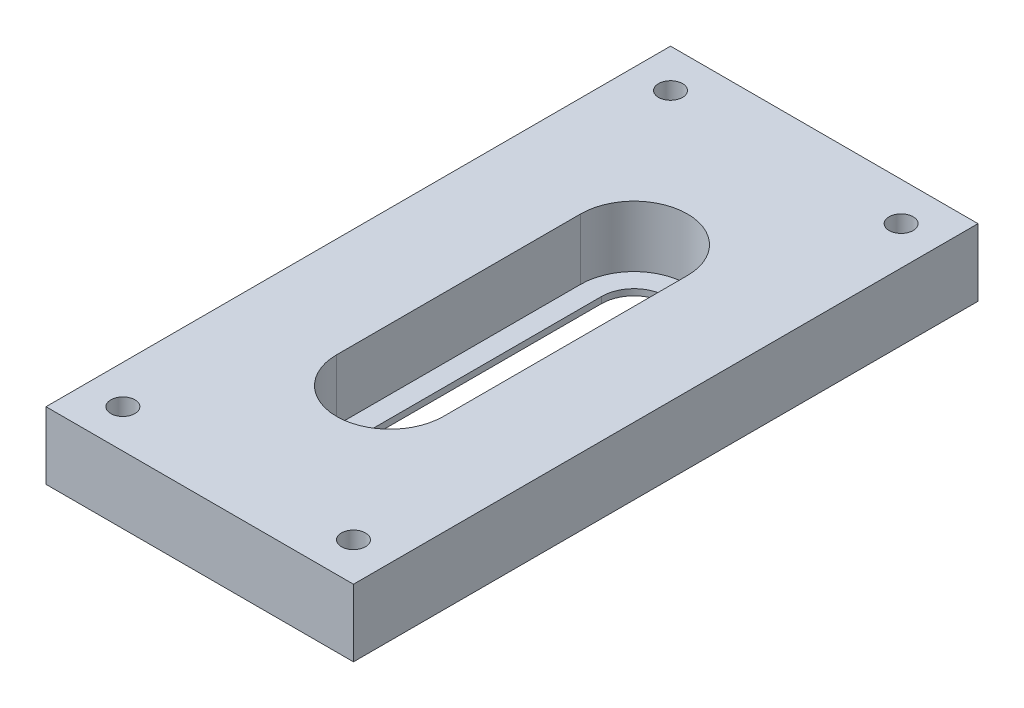
ISO-10303-21;
HEADER;
FILE_DESCRIPTION(('STEP AP214'),'2;1');
FILE_NAME('part.step','',(''),(''),'','','');
FILE_SCHEMA(('AUTOMOTIVE_DESIGN { 1 0 10303 214 1 1 1 1 }'));
ENDSEC;
DATA;
#1=APPLICATION_CONTEXT('core data for automotive mechanical design processes');
#2=APPLICATION_PROTOCOL_DEFINITION('international standard','automotive_design',2000,#1);
#3=PRODUCT_CONTEXT('',#1,'mechanical');
#4=PRODUCT('Part','Part','',(#3));
#5=PRODUCT_RELATED_PRODUCT_CATEGORY('part','',(#4));
#6=PRODUCT_DEFINITION_FORMATION('','',#4);
#7=PRODUCT_DEFINITION_CONTEXT('part definition',#1,'design');
#8=PRODUCT_DEFINITION('design','',#6,#7);
#9=PRODUCT_DEFINITION_SHAPE('','',#8);
#10=(LENGTH_UNIT() NAMED_UNIT(*) SI_UNIT(.MILLI.,.METRE.));
#11=(NAMED_UNIT(*) PLANE_ANGLE_UNIT() SI_UNIT($,.RADIAN.));
#12=(NAMED_UNIT(*) SI_UNIT($,.STERADIAN.) SOLID_ANGLE_UNIT());
#13=UNCERTAINTY_MEASURE_WITH_UNIT(LENGTH_MEASURE(1.E-05),#10,'distance_accuracy_value','');
#14=(GEOMETRIC_REPRESENTATION_CONTEXT(3) GLOBAL_UNCERTAINTY_ASSIGNED_CONTEXT((#13)) GLOBAL_UNIT_ASSIGNED_CONTEXT((#10,
#11,#12)) REPRESENTATION_CONTEXT('',''));
#15=CARTESIAN_POINT('',(0.,0.,0.));
#16=DIRECTION('',(0.,0.,1.));
#17=DIRECTION('',(1.,0.,0.));
#18=AXIS2_PLACEMENT_3D('',#15,#16,#17);
#19=CARTESIAN_POINT('',(38.9643564401324,20.9281245562062,11.5915559066913));
#20=DIRECTION('',(-1.,0.,0.));
#21=DIRECTION('',(0.,0.,1.));
#22=AXIS2_PLACEMENT_3D('',#19,#20,#21);
#23=PLANE('',#22);
#24=DIRECTION('',(0.,0.,1.));
#25=VECTOR('',#24,1.);
#26=CARTESIAN_POINT('',(38.9643564401324,27.9281245562062,11.5915559066913));
#27=LINE('',#26,#25);
#28=CARTESIAN_POINT('',(38.9643564401324,27.9281245562062,11.5915559066913));
#29=VERTEX_POINT('',#28);
#30=CARTESIAN_POINT('',(38.9643564401324,27.9281245562062,76.5915559066913));
#31=VERTEX_POINT('',#30);
#32=EDGE_CURVE('E172',#29,#31,#27,.T.);
#33=ORIENTED_EDGE('',*,*,#32,.T.);
#34=DIRECTION('',(0.,1.,0.));
#35=VECTOR('',#34,1.);
#36=CARTESIAN_POINT('',(38.9643564401324,20.9281245562062,76.5915559066913));
#37=LINE('',#36,#35);
#38=CARTESIAN_POINT('',(38.9643564401324,20.9281245562062,76.5915559066913));
#39=VERTEX_POINT('',#38);
#40=EDGE_CURVE('E11',#39,#31,#37,.T.);
#41=ORIENTED_EDGE('',*,*,#40,.F.);
#42=DIRECTION('',(0.,0.,1.));
#43=VECTOR('',#42,1.);
#44=CARTESIAN_POINT('',(38.9643564401324,20.9281245562062,11.5915559066913));
#45=LINE('',#44,#43);
#46=CARTESIAN_POINT('',(38.9643564401324,20.9281245562062,11.5915559066913));
#47=VERTEX_POINT('',#46);
#48=EDGE_CURVE('E173',#47,#39,#45,.T.);
#49=ORIENTED_EDGE('',*,*,#48,.F.);
#50=DIRECTION('',(0.,1.,0.));
#51=VECTOR('',#50,1.);
#52=CARTESIAN_POINT('',(38.9643564401324,20.9281245562062,11.5915559066913));
#53=LINE('',#52,#51);
#54=EDGE_CURVE('E183',#47,#29,#53,.T.);
#55=ORIENTED_EDGE('',*,*,#54,.T.);
#56=EDGE_LOOP('',(#33,#41,#49,#55));
#57=FACE_BOUND('',#56,.T.);
#58=ADVANCED_FACE('F33',(#57),#23,.F.);
#59=CARTESIAN_POINT('',(38.9643564401324,20.9281245562062,76.5915559066913));
#60=DIRECTION('',(0.,0.,-1.));
#61=DIRECTION('',(-1.,0.,0.));
#62=AXIS2_PLACEMENT_3D('',#59,#60,#61);
#63=PLANE('',#62);
#64=DIRECTION('',(-1.,0.,0.));
#65=VECTOR('',#64,1.);
#66=CARTESIAN_POINT('',(38.9643564401324,27.9281245562062,76.5915559066913));
#67=LINE('',#66,#65);
#68=CARTESIAN_POINT('',(6.9643564401324,27.9281245562062,76.5915559066913));
#69=VERTEX_POINT('',#68);
#70=EDGE_CURVE('E186',#31,#69,#67,.T.);
#71=ORIENTED_EDGE('',*,*,#70,.T.);
#72=DIRECTION('',(0.,1.,0.));
#73=VECTOR('',#72,1.);
#74=CARTESIAN_POINT('',(6.9643564401324,20.9281245562062,76.5915559066913));
#75=LINE('',#74,#73);
#76=CARTESIAN_POINT('',(6.9643564401324,20.9281245562062,76.5915559066913));
#77=VERTEX_POINT('',#76);
#78=EDGE_CURVE('E40',#77,#69,#75,.T.);
#79=ORIENTED_EDGE('',*,*,#78,.F.);
#80=DIRECTION('',(-1.,0.,0.));
#81=VECTOR('',#80,1.);
#82=CARTESIAN_POINT('',(38.9643564401324,20.9281245562062,76.5915559066913));
#83=LINE('',#82,#81);
#84=EDGE_CURVE('E176',#39,#77,#83,.T.);
#85=ORIENTED_EDGE('',*,*,#84,.F.);
#86=ORIENTED_EDGE('',*,*,#40,.T.);
#87=EDGE_LOOP('',(#71,#79,#85,#86));
#88=FACE_BOUND('',#87,.T.);
#89=ADVANCED_FACE('F215',(#88),#63,.F.);
#90=CARTESIAN_POINT('',(6.9643564401324,20.9281245562062,11.5915559066913));
#91=DIRECTION('',(1.,0.,0.));
#92=DIRECTION('',(0.,0.,-1.));
#93=AXIS2_PLACEMENT_3D('',#90,#91,#92);
#94=PLANE('',#93);
#95=DIRECTION('',(0.,0.,-1.));
#96=VECTOR('',#95,1.);
#97=CARTESIAN_POINT('',(6.9643564401324,27.9281245562062,11.5915559066913));
#98=LINE('',#97,#96);
#99=CARTESIAN_POINT('',(6.9643564401324,27.9281245562062,11.5915559066913));
#100=VERTEX_POINT('',#99);
#101=EDGE_CURVE('E188',#69,#100,#98,.T.);
#102=ORIENTED_EDGE('',*,*,#101,.T.);
#103=DIRECTION('',(0.,1.,0.));
#104=VECTOR('',#103,1.);
#105=CARTESIAN_POINT('',(6.9643564401324,20.9281245562062,11.5915559066913));
#106=LINE('',#105,#104);
#107=CARTESIAN_POINT('',(6.9643564401324,20.9281245562062,11.5915559066913));
#108=VERTEX_POINT('',#107);
#109=EDGE_CURVE('E193',#108,#100,#106,.T.);
#110=ORIENTED_EDGE('',*,*,#109,.F.);
#111=DIRECTION('',(0.,0.,-1.));
#112=VECTOR('',#111,1.);
#113=CARTESIAN_POINT('',(6.9643564401324,20.9281245562062,11.5915559066913));
#114=LINE('',#113,#112);
#115=EDGE_CURVE('E179',#77,#108,#114,.T.);
#116=ORIENTED_EDGE('',*,*,#115,.F.);
#117=ORIENTED_EDGE('',*,*,#78,.T.);
#118=EDGE_LOOP('',(#102,#110,#116,#117));
#119=FACE_BOUND('',#118,.T.);
#120=ADVANCED_FACE('F200',(#119),#94,.F.);
#121=CARTESIAN_POINT('',(38.9643564401324,20.9281245562062,11.5915559066913));
#122=DIRECTION('',(0.,0.,1.));
#123=DIRECTION('',(1.,0.,0.));
#124=AXIS2_PLACEMENT_3D('',#121,#122,#123);
#125=PLANE('',#124);
#126=DIRECTION('',(1.,0.,0.));
#127=VECTOR('',#126,1.);
#128=CARTESIAN_POINT('',(38.9643564401324,27.9281245562062,11.5915559066913));
#129=LINE('',#128,#127);
#130=EDGE_CURVE('E177',#100,#29,#129,.T.);
#131=ORIENTED_EDGE('',*,*,#130,.T.);
#132=ORIENTED_EDGE('',*,*,#54,.F.);
#133=DIRECTION('',(1.,0.,0.));
#134=VECTOR('',#133,1.);
#135=CARTESIAN_POINT('',(38.9643564401324,20.9281245562062,11.5915559066913));
#136=LINE('',#135,#134);
#137=EDGE_CURVE('E181',#108,#47,#136,.T.);
#138=ORIENTED_EDGE('',*,*,#137,.F.);
#139=ORIENTED_EDGE('',*,*,#109,.T.);
#140=EDGE_LOOP('',(#131,#132,#138,#139));
#141=FACE_BOUND('',#140,.T.);
#142=ADVANCED_FACE('F209',(#141),#125,.F.);
#143=CARTESIAN_POINT('',(0.,20.9281245562062,0.));
#144=DIRECTION('',(0.,-1.,0.));
#145=DIRECTION('',(0.,0.,-1.));
#146=AXIS2_PLACEMENT_3D('',#143,#144,#145);
#147=PLANE('',#146);
#148=DIRECTION('',(0.,0.,1.));
#149=VECTOR('',#148,1.);
#150=CARTESIAN_POINT('',(19.5861564401324,20.9281245562062,31.3915559066913));
#151=LINE('',#150,#149);
#152=CARTESIAN_POINT('',(19.5861564401324,20.9281245562062,31.3915559066913));
#153=VERTEX_POINT('',#152);
#154=CARTESIAN_POINT('',(19.5861564401324,20.9281245562062,56.7915559066913));
#155=VERTEX_POINT('',#154);
#156=EDGE_CURVE('E55',#153,#155,#151,.T.);
#157=ORIENTED_EDGE('',*,*,#156,.T.);
#158=CARTESIAN_POINT('',(22.9643564401324,20.9281245562062,56.7915559066913));
#159=DIRECTION('',(0.,1.,0.));
#160=DIRECTION('',(0.,0.,1.));
#161=AXIS2_PLACEMENT_3D('',#158,#159,#160);
#162=CIRCLE('',#161,3.3782);
#163=CARTESIAN_POINT('',(26.3425564401324,20.9281245562062,56.7915559066913));
#164=VERTEX_POINT('',#163);
#165=EDGE_CURVE('E136',#155,#164,#162,.T.);
#166=ORIENTED_EDGE('',*,*,#165,.T.);
#167=DIRECTION('',(0.,0.,-1.));
#168=VECTOR('',#167,1.);
#169=CARTESIAN_POINT('',(26.3425564401324,20.9281245562062,31.3915559066913));
#170=LINE('',#169,#168);
#171=CARTESIAN_POINT('',(26.3425564401324,20.9281245562062,31.3915559066913));
#172=VERTEX_POINT('',#171);
#173=EDGE_CURVE('E128',#164,#172,#170,.T.);
#174=ORIENTED_EDGE('',*,*,#173,.T.);
#175=CARTESIAN_POINT('',(22.9643564401324,20.9281245562062,31.3915559066913));
#176=DIRECTION('',(0.,1.,0.));
#177=DIRECTION('',(0.,0.,1.));
#178=AXIS2_PLACEMENT_3D('',#175,#176,#177);
#179=CIRCLE('',#178,3.3782);
#180=EDGE_CURVE('E138',#172,#153,#179,.T.);
#181=ORIENTED_EDGE('',*,*,#180,.T.);
#182=EDGE_LOOP('',(#157,#166,#174,#181));
#183=FACE_BOUND('',#182,.T.);
#184=CARTESIAN_POINT('',(10.9643560601324,20.9281245562062,15.5915559866913));
#185=DIRECTION('',(0.,1.,0.));
#186=DIRECTION('',(0.,0.,1.));
#187=AXIS2_PLACEMENT_3D('',#184,#185,#186);
#188=CIRCLE('',#187,1.25);
#189=CARTESIAN_POINT('',(10.9643560601324,20.9281245562062,16.8415559866913));
#190=VERTEX_POINT('',#189);
#191=EDGE_CURVE('E146',#190,#190,#188,.T.);
#192=ORIENTED_EDGE('',*,*,#191,.T.);
#193=EDGE_LOOP('',(#192));
#194=FACE_BOUND('',#193,.T.);
#195=CARTESIAN_POINT('',(34.9643563201324,20.9281245562062,15.5915559866913));
#196=DIRECTION('',(0.,1.,0.));
#197=DIRECTION('',(0.,0.,1.));
#198=AXIS2_PLACEMENT_3D('',#195,#196,#197);
#199=CIRCLE('',#198,1.25);
#200=CARTESIAN_POINT('',(34.9643563201324,20.9281245562062,16.8415559866913));
#201=VERTEX_POINT('',#200);
#202=EDGE_CURVE('E157',#201,#201,#199,.T.);
#203=ORIENTED_EDGE('',*,*,#202,.T.);
#204=EDGE_LOOP('',(#203));
#205=FACE_BOUND('',#204,.T.);
#206=CARTESIAN_POINT('',(34.9643563201324,20.9281245562062,72.5915562866913));
#207=DIRECTION('',(0.,1.,0.));
#208=DIRECTION('',(0.,0.,1.));
#209=AXIS2_PLACEMENT_3D('',#206,#207,#208);
#210=CIRCLE('',#209,1.25);
#211=CARTESIAN_POINT('',(34.9643563201324,20.9281245562062,73.8415562866913));
#212=VERTEX_POINT('',#211);
#213=EDGE_CURVE('E163',#212,#212,#210,.T.);
#214=ORIENTED_EDGE('',*,*,#213,.T.);
#215=EDGE_LOOP('',(#214));
#216=FACE_BOUND('',#215,.T.);
#217=CARTESIAN_POINT('',(10.9643560601324,20.9281245562062,72.5915562866913));
#218=DIRECTION('',(0.,1.,0.));
#219=DIRECTION('',(0.,0.,1.));
#220=AXIS2_PLACEMENT_3D('',#217,#218,#219);
#221=CIRCLE('',#220,1.25);
#222=CARTESIAN_POINT('',(10.9643560601324,20.9281245562062,73.8415562866913));
#223=VERTEX_POINT('',#222);
#224=EDGE_CURVE('E169',#223,#223,#221,.T.);
#225=ORIENTED_EDGE('',*,*,#224,.T.);
#226=EDGE_LOOP('',(#225));
#227=FACE_BOUND('',#226,.T.);
#228=ORIENTED_EDGE('',*,*,#48,.T.);
#229=ORIENTED_EDGE('',*,*,#84,.T.);
#230=ORIENTED_EDGE('',*,*,#115,.T.);
#231=ORIENTED_EDGE('',*,*,#137,.T.);
#232=EDGE_LOOP('',(#228,#229,#230,#231));
#233=FACE_BOUND('',#232,.T.);
#234=ADVANCED_FACE('F133',(#183,#194,#205,#216,#227,#233),#147,.T.);
#235=CARTESIAN_POINT('',(0.,27.9281245562062,0.));
#236=DIRECTION('',(0.,-1.,0.));
#237=DIRECTION('',(0.,0.,-1.));
#238=AXIS2_PLACEMENT_3D('',#235,#236,#237);
#239=PLANE('',#238);
#240=CARTESIAN_POINT('',(22.9643564401324,27.9281245562062,31.3915559066913));
#241=DIRECTION('',(0.,1.,0.));
#242=DIRECTION('',(0.,0.,1.));
#243=AXIS2_PLACEMENT_3D('',#240,#241,#242);
#244=CIRCLE('',#243,5.55625);
#245=CARTESIAN_POINT('',(28.5206064401324,27.9281245562062,31.3915559066913));
#246=VERTEX_POINT('',#245);
#247=CARTESIAN_POINT('',(17.4081064401324,27.9281245562062,31.3915559066913));
#248=VERTEX_POINT('',#247);
#249=EDGE_CURVE('E410',#246,#248,#244,.T.);
#250=ORIENTED_EDGE('',*,*,#249,.F.);
#251=DIRECTION('',(0.,0.,-1.));
#252=VECTOR('',#251,1.);
#253=CARTESIAN_POINT('',(28.5206064401324,27.9281245562062,31.3915559066913));
#254=LINE('',#253,#252);
#255=CARTESIAN_POINT('',(28.5206064401324,27.9281245562062,56.7915559066913));
#256=VERTEX_POINT('',#255);
#257=EDGE_CURVE('E413',#256,#246,#254,.T.);
#258=ORIENTED_EDGE('',*,*,#257,.F.);
#259=CARTESIAN_POINT('',(22.9643564401324,27.9281245562062,56.7915559066913));
#260=DIRECTION('',(0.,1.,0.));
#261=DIRECTION('',(0.,0.,1.));
#262=AXIS2_PLACEMENT_3D('',#259,#260,#261);
#263=CIRCLE('',#262,5.55625);
#264=CARTESIAN_POINT('',(17.4081064401324,27.9281245562062,56.7915559066913));
#265=VERTEX_POINT('',#264);
#266=EDGE_CURVE('E412',#265,#256,#263,.T.);
#267=ORIENTED_EDGE('',*,*,#266,.F.);
#268=DIRECTION('',(0.,0.,1.));
#269=VECTOR('',#268,1.);
#270=CARTESIAN_POINT('',(17.4081064401324,27.9281245562062,31.3915559066913));
#271=LINE('',#270,#269);
#272=EDGE_CURVE('E398',#248,#265,#271,.T.);
#273=ORIENTED_EDGE('',*,*,#272,.F.);
#274=EDGE_LOOP('',(#250,#258,#267,#273));
#275=FACE_BOUND('',#274,.T.);
#276=CARTESIAN_POINT('',(10.9643560601324,27.9281245562062,15.5915559866913));
#277=DIRECTION('',(0.,1.,0.));
#278=DIRECTION('',(0.,0.,1.));
#279=AXIS2_PLACEMENT_3D('',#276,#277,#278);
#280=CIRCLE('',#279,1.25);
#281=CARTESIAN_POINT('',(10.9643560601324,27.9281245562062,16.8415559866913));
#282=VERTEX_POINT('',#281);
#283=EDGE_CURVE('E142',#282,#282,#280,.T.);
#284=ORIENTED_EDGE('',*,*,#283,.F.);
#285=EDGE_LOOP('',(#284));
#286=FACE_BOUND('',#285,.T.);
#287=CARTESIAN_POINT('',(34.9643563201324,27.9281245562062,15.5915559866913));
#288=DIRECTION('',(0.,1.,0.));
#289=DIRECTION('',(0.,0.,1.));
#290=AXIS2_PLACEMENT_3D('',#287,#288,#289);
#291=CIRCLE('',#290,1.25);
#292=CARTESIAN_POINT('',(34.9643563201324,27.9281245562062,16.8415559866913));
#293=VERTEX_POINT('',#292);
#294=EDGE_CURVE('E154',#293,#293,#291,.T.);
#295=ORIENTED_EDGE('',*,*,#294,.F.);
#296=EDGE_LOOP('',(#295));
#297=FACE_BOUND('',#296,.T.);
#298=CARTESIAN_POINT('',(34.9643563201324,27.9281245562062,72.5915562866913));
#299=DIRECTION('',(0.,1.,0.));
#300=DIRECTION('',(0.,0.,1.));
#301=AXIS2_PLACEMENT_3D('',#298,#299,#300);
#302=CIRCLE('',#301,1.25);
#303=CARTESIAN_POINT('',(34.9643563201324,27.9281245562062,73.8415562866913));
#304=VERTEX_POINT('',#303);
#305=EDGE_CURVE('E160',#304,#304,#302,.T.);
#306=ORIENTED_EDGE('',*,*,#305,.F.);
#307=EDGE_LOOP('',(#306));
#308=FACE_BOUND('',#307,.T.);
#309=CARTESIAN_POINT('',(10.9643560601324,27.9281245562062,72.5915562866913));
#310=DIRECTION('',(0.,1.,0.));
#311=DIRECTION('',(0.,0.,1.));
#312=AXIS2_PLACEMENT_3D('',#309,#310,#311);
#313=CIRCLE('',#312,1.25);
#314=CARTESIAN_POINT('',(10.9643560601324,27.9281245562062,73.8415562866913));
#315=VERTEX_POINT('',#314);
#316=EDGE_CURVE('E166',#315,#315,#313,.T.);
#317=ORIENTED_EDGE('',*,*,#316,.F.);
#318=EDGE_LOOP('',(#317));
#319=FACE_BOUND('',#318,.T.);
#320=ORIENTED_EDGE('',*,*,#32,.F.);
#321=ORIENTED_EDGE('',*,*,#130,.F.);
#322=ORIENTED_EDGE('',*,*,#101,.F.);
#323=ORIENTED_EDGE('',*,*,#70,.F.);
#324=EDGE_LOOP('',(#320,#321,#322,#323));
#325=FACE_BOUND('',#324,.T.);
#326=ADVANCED_FACE('F206',(#275,#286,#297,#308,#319,#325),#239,.F.);
#327=CARTESIAN_POINT('',(10.9643560601324,27.9281245562062,72.5915562866913));
#328=DIRECTION('',(0.,1.,0.));
#329=DIRECTION('',(0.,0.,1.));
#330=AXIS2_PLACEMENT_3D('',#327,#328,#329);
#331=CYLINDRICAL_SURFACE('',#330,1.25);
#332=ORIENTED_EDGE('',*,*,#224,.F.);
#333=EDGE_LOOP('',(#332));
#334=FACE_BOUND('',#333,.T.);
#335=ORIENTED_EDGE('',*,*,#316,.T.);
#336=EDGE_LOOP('',(#335));
#337=FACE_BOUND('',#336,.T.);
#338=ADVANCED_FACE('F227',(#334,#337),#331,.F.);
#339=CARTESIAN_POINT('',(34.9643563201324,27.9281245562062,72.5915562866913));
#340=DIRECTION('',(0.,1.,0.));
#341=DIRECTION('',(0.,0.,1.));
#342=AXIS2_PLACEMENT_3D('',#339,#340,#341);
#343=CYLINDRICAL_SURFACE('',#342,1.25);
#344=ORIENTED_EDGE('',*,*,#213,.F.);
#345=EDGE_LOOP('',(#344));
#346=FACE_BOUND('',#345,.T.);
#347=ORIENTED_EDGE('',*,*,#305,.T.);
#348=EDGE_LOOP('',(#347));
#349=FACE_BOUND('',#348,.T.);
#350=ADVANCED_FACE('F233',(#346,#349),#343,.F.);
#351=CARTESIAN_POINT('',(34.9643563201324,27.9281245562062,15.5915559866913));
#352=DIRECTION('',(0.,1.,0.));
#353=DIRECTION('',(0.,0.,1.));
#354=AXIS2_PLACEMENT_3D('',#351,#352,#353);
#355=CYLINDRICAL_SURFACE('',#354,1.25);
#356=ORIENTED_EDGE('',*,*,#202,.F.);
#357=EDGE_LOOP('',(#356));
#358=FACE_BOUND('',#357,.T.);
#359=ORIENTED_EDGE('',*,*,#294,.T.);
#360=EDGE_LOOP('',(#359));
#361=FACE_BOUND('',#360,.T.);
#362=ADVANCED_FACE('F237',(#358,#361),#355,.F.);
#363=CARTESIAN_POINT('',(10.9643560601324,27.9281245562062,15.5915559866913));
#364=DIRECTION('',(0.,1.,0.));
#365=DIRECTION('',(0.,0.,1.));
#366=AXIS2_PLACEMENT_3D('',#363,#364,#365);
#367=CYLINDRICAL_SURFACE('',#366,1.25);
#368=ORIENTED_EDGE('',*,*,#191,.F.);
#369=EDGE_LOOP('',(#368));
#370=FACE_BOUND('',#369,.T.);
#371=ORIENTED_EDGE('',*,*,#283,.T.);
#372=EDGE_LOOP('',(#371));
#373=FACE_BOUND('',#372,.T.);
#374=ADVANCED_FACE('F241',(#370,#373),#367,.F.);
#375=CARTESIAN_POINT('',(22.9643564401324,27.9281245562062,56.7915559066913));
#376=DIRECTION('',(0.,1.,0.));
#377=DIRECTION('',(0.,0.,1.));
#378=AXIS2_PLACEMENT_3D('',#375,#376,#377);
#379=CYLINDRICAL_SURFACE('',#378,3.3782);
#380=CARTESIAN_POINT('',(22.9643564401324,21.5781245562062,56.7915559066913));
#381=DIRECTION('',(0.,1.,0.));
#382=DIRECTION('',(0.,0.,1.));
#383=AXIS2_PLACEMENT_3D('',#380,#381,#382);
#384=CIRCLE('',#383,3.3782);
#385=CARTESIAN_POINT('',(19.5861564401324,21.5781245562062,56.7915559066913));
#386=VERTEX_POINT('',#385);
#387=CARTESIAN_POINT('',(26.3425564401324,21.5781245562062,56.7915559066913));
#388=VERTEX_POINT('',#387);
#389=EDGE_CURVE('E143',#386,#388,#384,.T.);
#390=ORIENTED_EDGE('',*,*,#389,.T.);
#391=DIRECTION('',(0.,1.,0.));
#392=VECTOR('',#391,1.);
#393=CARTESIAN_POINT('',(26.3425564401324,20.9281245562062,56.7915559066913));
#394=LINE('',#393,#392);
#395=EDGE_CURVE('E127',#164,#388,#394,.T.);
#396=ORIENTED_EDGE('',*,*,#395,.F.);
#397=ORIENTED_EDGE('',*,*,#165,.F.);
#398=DIRECTION('',(0.,1.,0.));
#399=VECTOR('',#398,1.);
#400=CARTESIAN_POINT('',(19.5861564401324,20.9281245562062,56.7915559066913));
#401=LINE('',#400,#399);
#402=EDGE_CURVE('E119',#155,#386,#401,.T.);
#403=ORIENTED_EDGE('',*,*,#402,.T.);
#404=EDGE_LOOP('',(#390,#396,#397,#403));
#405=FACE_BOUND('',#404,.T.);
#406=ADVANCED_FACE('F141',(#405),#379,.F.);
#407=CARTESIAN_POINT('',(26.3425564401324,21.5781245562062,56.7915559066913));
#408=DIRECTION('',(0.,-1.,0.));
#409=DIRECTION('',(0.,0.,-1.));
#410=AXIS2_PLACEMENT_3D('',#407,#408,#409);
#411=PLANE('',#410);
#412=CARTESIAN_POINT('',(22.9643564401324,21.5781245562062,56.7915559066913));
#413=DIRECTION('',(0.,1.,0.));
#414=DIRECTION('',(0.,0.,1.));
#415=AXIS2_PLACEMENT_3D('',#412,#413,#414);
#416=CIRCLE('',#415,5.55625);
#417=CARTESIAN_POINT('',(17.4081064401324,21.5781245562062,56.7915559066913));
#418=VERTEX_POINT('',#417);
#419=CARTESIAN_POINT('',(28.5206064401324,21.5781245562062,56.7915559066913));
#420=VERTEX_POINT('',#419);
#421=EDGE_CURVE('E148',#418,#420,#416,.T.);
#422=ORIENTED_EDGE('',*,*,#421,.T.);
#423=DIRECTION('',(0.,0.,-1.));
#424=VECTOR('',#423,1.);
#425=CARTESIAN_POINT('',(28.5206064401324,21.5781245562062,31.3915559066913));
#426=LINE('',#425,#424);
#427=CARTESIAN_POINT('',(28.5206064401324,21.5781245562062,31.3915559066913));
#428=VERTEX_POINT('',#427);
#429=EDGE_CURVE('E432',#420,#428,#426,.T.);
#430=ORIENTED_EDGE('',*,*,#429,.T.);
#431=CARTESIAN_POINT('',(22.9643564401324,21.5781245562062,31.3915559066913));
#432=DIRECTION('',(0.,1.,0.));
#433=DIRECTION('',(0.,0.,1.));
#434=AXIS2_PLACEMENT_3D('',#431,#432,#433);
#435=CIRCLE('',#434,5.55625);
#436=CARTESIAN_POINT('',(17.4081064401324,21.5781245562062,31.3915559066913));
#437=VERTEX_POINT('',#436);
#438=EDGE_CURVE('E417',#428,#437,#435,.T.);
#439=ORIENTED_EDGE('',*,*,#438,.T.);
#440=DIRECTION('',(0.,0.,1.));
#441=VECTOR('',#440,1.);
#442=CARTESIAN_POINT('',(17.4081064401324,21.5781245562062,31.3915559066913));
#443=LINE('',#442,#441);
#444=EDGE_CURVE('E400',#437,#418,#443,.T.);
#445=ORIENTED_EDGE('',*,*,#444,.T.);
#446=EDGE_LOOP('',(#422,#430,#439,#445));
#447=FACE_BOUND('',#446,.T.);
#448=ORIENTED_EDGE('',*,*,#389,.F.);
#449=DIRECTION('',(0.,0.,1.));
#450=VECTOR('',#449,1.);
#451=CARTESIAN_POINT('',(19.5861564401324,21.5781245562062,31.3915559066913));
#452=LINE('',#451,#450);
#453=CARTESIAN_POINT('',(19.5861564401324,21.5781245562062,31.3915559066913));
#454=VERTEX_POINT('',#453);
#455=EDGE_CURVE('E122',#454,#386,#452,.T.);
#456=ORIENTED_EDGE('',*,*,#455,.F.);
#457=CARTESIAN_POINT('',(22.9643564401324,21.5781245562062,31.3915559066913));
#458=DIRECTION('',(0.,1.,0.));
#459=DIRECTION('',(0.,0.,1.));
#460=AXIS2_PLACEMENT_3D('',#457,#458,#459);
#461=CIRCLE('',#460,3.3782);
#462=CARTESIAN_POINT('',(26.3425564401324,21.5781245562062,31.3915559066913));
#463=VERTEX_POINT('',#462);
#464=EDGE_CURVE('E420',#463,#454,#461,.T.);
#465=ORIENTED_EDGE('',*,*,#464,.F.);
#466=DIRECTION('',(0.,0.,-1.));
#467=VECTOR('',#466,1.);
#468=CARTESIAN_POINT('',(26.3425564401324,21.5781245562062,31.3915559066913));
#469=LINE('',#468,#467);
#470=EDGE_CURVE('E47',#388,#463,#469,.T.);
#471=ORIENTED_EDGE('',*,*,#470,.F.);
#472=EDGE_LOOP('',(#448,#456,#465,#471));
#473=FACE_BOUND('',#472,.T.);
#474=ADVANCED_FACE('F248',(#447,#473),#411,.F.);
#475=CARTESIAN_POINT('',(22.9643564401324,27.9281245562062,56.7915559066913));
#476=DIRECTION('',(0.,1.,0.));
#477=DIRECTION('',(0.,0.,1.));
#478=AXIS2_PLACEMENT_3D('',#475,#476,#477);
#479=CYLINDRICAL_SURFACE('',#478,5.55625);
#480=ORIENTED_EDGE('',*,*,#266,.T.);
#481=DIRECTION('',(0.,1.,0.));
#482=VECTOR('',#481,1.);
#483=CARTESIAN_POINT('',(28.5206064401324,-6.14637104335341,56.7915559066913));
#484=LINE('',#483,#482);
#485=EDGE_CURVE('E434',#420,#256,#484,.T.);
#486=ORIENTED_EDGE('',*,*,#485,.F.);
#487=ORIENTED_EDGE('',*,*,#421,.F.);
#488=DIRECTION('',(0.,1.,0.));
#489=VECTOR('',#488,1.);
#490=CARTESIAN_POINT('',(17.4081064401324,-6.14637104335341,56.7915559066913));
#491=LINE('',#490,#489);
#492=EDGE_CURVE('E418',#418,#265,#491,.T.);
#493=ORIENTED_EDGE('',*,*,#492,.T.);
#494=EDGE_LOOP('',(#480,#486,#487,#493));
#495=FACE_BOUND('',#494,.T.);
#496=ADVANCED_FACE('F251',(#495),#479,.F.);
#497=CARTESIAN_POINT('',(22.9643564401324,27.9281245562062,31.3915559066913));
#498=DIRECTION('',(0.,1.,0.));
#499=DIRECTION('',(0.,0.,1.));
#500=AXIS2_PLACEMENT_3D('',#497,#498,#499);
#501=CYLINDRICAL_SURFACE('',#500,3.3782);
#502=ORIENTED_EDGE('',*,*,#464,.T.);
#503=DIRECTION('',(0.,1.,0.));
#504=VECTOR('',#503,1.);
#505=CARTESIAN_POINT('',(19.5861564401324,20.9281245562062,31.3915559066913));
#506=LINE('',#505,#504);
#507=EDGE_CURVE('E414',#153,#454,#506,.T.);
#508=ORIENTED_EDGE('',*,*,#507,.F.);
#509=ORIENTED_EDGE('',*,*,#180,.F.);
#510=DIRECTION('',(0.,1.,0.));
#511=VECTOR('',#510,1.);
#512=CARTESIAN_POINT('',(26.3425564401324,20.9281245562062,31.3915559066913));
#513=LINE('',#512,#511);
#514=EDGE_CURVE('E441',#172,#463,#513,.T.);
#515=ORIENTED_EDGE('',*,*,#514,.T.);
#516=EDGE_LOOP('',(#502,#508,#509,#515));
#517=FACE_BOUND('',#516,.T.);
#518=ADVANCED_FACE('F255',(#517),#501,.F.);
#519=CARTESIAN_POINT('',(22.9643564401324,27.9281245562062,31.3915559066913));
#520=DIRECTION('',(0.,1.,0.));
#521=DIRECTION('',(0.,0.,1.));
#522=AXIS2_PLACEMENT_3D('',#519,#520,#521);
#523=CYLINDRICAL_SURFACE('',#522,5.55625);
#524=ORIENTED_EDGE('',*,*,#438,.F.);
#525=DIRECTION('',(0.,1.,0.));
#526=VECTOR('',#525,1.);
#527=CARTESIAN_POINT('',(28.5206064401324,-6.14637104335341,31.3915559066913));
#528=LINE('',#527,#526);
#529=EDGE_CURVE('E404',#428,#246,#528,.T.);
#530=ORIENTED_EDGE('',*,*,#529,.T.);
#531=ORIENTED_EDGE('',*,*,#249,.T.);
#532=DIRECTION('',(0.,1.,0.));
#533=VECTOR('',#532,1.);
#534=CARTESIAN_POINT('',(17.4081064401324,-6.14637104335341,31.3915559066913));
#535=LINE('',#534,#533);
#536=EDGE_CURVE('E395',#437,#248,#535,.T.);
#537=ORIENTED_EDGE('',*,*,#536,.F.);
#538=EDGE_LOOP('',(#524,#530,#531,#537));
#539=FACE_BOUND('',#538,.T.);
#540=ADVANCED_FACE('F259',(#539),#523,.F.);
#541=CARTESIAN_POINT('',(28.5206064401324,-6.14637104335341,31.3915559066913));
#542=DIRECTION('',(1.,0.,0.));
#543=DIRECTION('',(0.,0.,-1.));
#544=AXIS2_PLACEMENT_3D('',#541,#542,#543);
#545=PLANE('',#544);
#546=ORIENTED_EDGE('',*,*,#485,.T.);
#547=ORIENTED_EDGE('',*,*,#257,.T.);
#548=ORIENTED_EDGE('',*,*,#529,.F.);
#549=ORIENTED_EDGE('',*,*,#429,.F.);
#550=EDGE_LOOP('',(#546,#547,#548,#549));
#551=FACE_BOUND('',#550,.T.);
#552=ADVANCED_FACE('F263',(#551),#545,.F.);
#553=CARTESIAN_POINT('',(17.4081064401324,-6.14637104335341,31.3915559066913));
#554=DIRECTION('',(-1.,0.,0.));
#555=DIRECTION('',(0.,0.,1.));
#556=AXIS2_PLACEMENT_3D('',#553,#554,#555);
#557=PLANE('',#556);
#558=ORIENTED_EDGE('',*,*,#536,.T.);
#559=ORIENTED_EDGE('',*,*,#272,.T.);
#560=ORIENTED_EDGE('',*,*,#492,.F.);
#561=ORIENTED_EDGE('',*,*,#444,.F.);
#562=EDGE_LOOP('',(#558,#559,#560,#561));
#563=FACE_BOUND('',#562,.T.);
#564=ADVANCED_FACE('F267',(#563),#557,.F.);
#565=CARTESIAN_POINT('',(26.3425564401324,20.9281245562062,31.3915559066913));
#566=DIRECTION('',(1.,0.,0.));
#567=DIRECTION('',(0.,0.,-1.));
#568=AXIS2_PLACEMENT_3D('',#565,#566,#567);
#569=PLANE('',#568);
#570=ORIENTED_EDGE('',*,*,#470,.T.);
#571=ORIENTED_EDGE('',*,*,#514,.F.);
#572=ORIENTED_EDGE('',*,*,#173,.F.);
#573=ORIENTED_EDGE('',*,*,#395,.T.);
#574=EDGE_LOOP('',(#570,#571,#572,#573));
#575=FACE_BOUND('',#574,.T.);
#576=ADVANCED_FACE('F271',(#575),#569,.F.);
#577=CARTESIAN_POINT('',(19.5861564401324,20.9281245562062,31.3915559066913));
#578=DIRECTION('',(-1.,0.,0.));
#579=DIRECTION('',(0.,0.,1.));
#580=AXIS2_PLACEMENT_3D('',#577,#578,#579);
#581=PLANE('',#580);
#582=ORIENTED_EDGE('',*,*,#455,.T.);
#583=ORIENTED_EDGE('',*,*,#402,.F.);
#584=ORIENTED_EDGE('',*,*,#156,.F.);
#585=ORIENTED_EDGE('',*,*,#507,.T.);
#586=EDGE_LOOP('',(#582,#583,#584,#585));
#587=FACE_BOUND('',#586,.T.);
#588=ADVANCED_FACE('F120',(#587),#581,.F.);
#589=CLOSED_SHELL('',(#58,#89,#120,#142,#234,#326,#338,#350,#362,#374,#406,#474,#496,#518,#540,
#552,#564,#576,#588));
#590=MANIFOLD_SOLID_BREP('B2',#589);
#591=ADVANCED_BREP_SHAPE_REPRESENTATION('',(#18,#590),#14);
#592=SHAPE_DEFINITION_REPRESENTATION(#9,#591);
ENDSEC;
END-ISO-10303-21;
